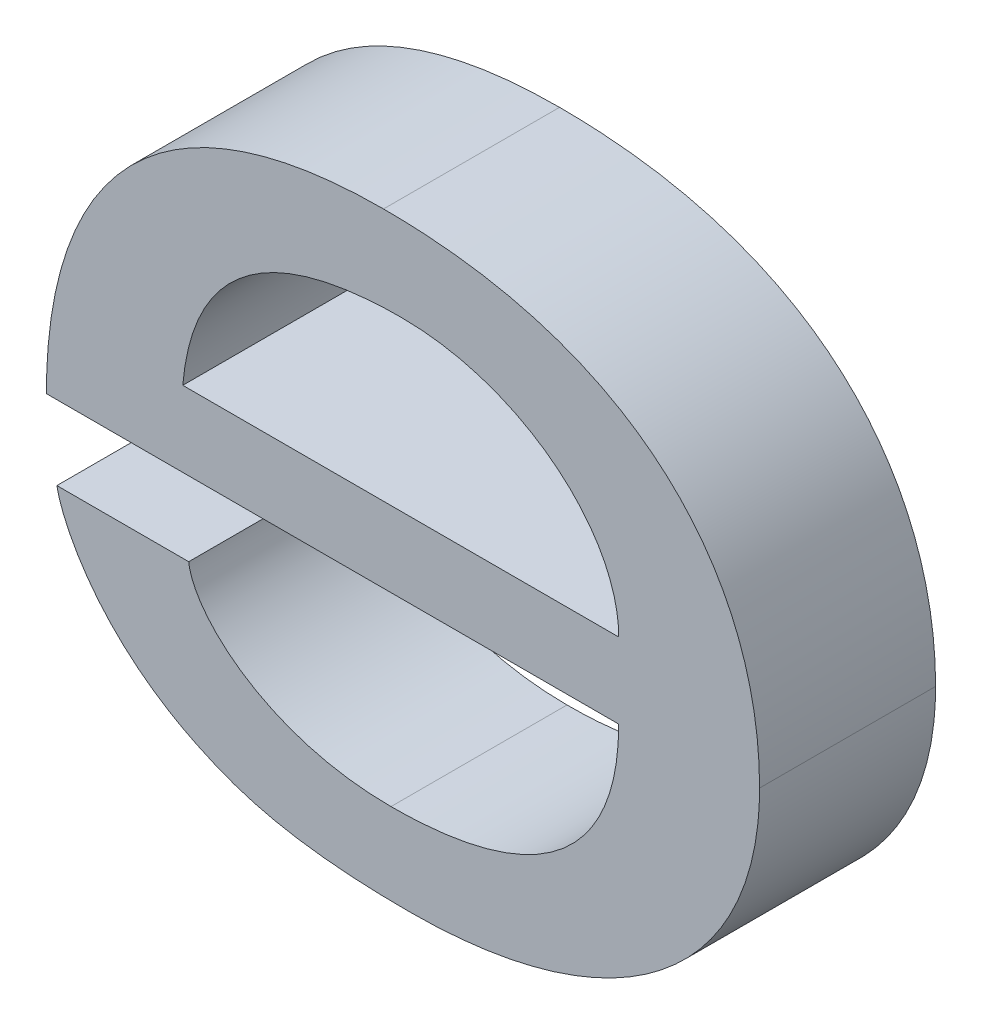
ISO-10303-21;
HEADER;
FILE_DESCRIPTION(('STEP AP214'),'2;1');
FILE_NAME('part.step','',(''),(''),'','','');
FILE_SCHEMA(('AUTOMOTIVE_DESIGN { 1 0 10303 214 1 1 1 1 }'));
ENDSEC;
DATA;
#1=APPLICATION_CONTEXT('core data for automotive mechanical design processes');
#2=APPLICATION_PROTOCOL_DEFINITION('international standard','automotive_design',2000,#1);
#3=PRODUCT_CONTEXT('',#1,'mechanical');
#4=PRODUCT('Part','Part','',(#3));
#5=PRODUCT_RELATED_PRODUCT_CATEGORY('part','',(#4));
#6=PRODUCT_DEFINITION_FORMATION('','',#4);
#7=PRODUCT_DEFINITION_CONTEXT('part definition',#1,'design');
#8=PRODUCT_DEFINITION('design','',#6,#7);
#9=PRODUCT_DEFINITION_SHAPE('','',#8);
#10=(LENGTH_UNIT() NAMED_UNIT(*) SI_UNIT(.MILLI.,.METRE.));
#11=(NAMED_UNIT(*) PLANE_ANGLE_UNIT() SI_UNIT($,.RADIAN.));
#12=(NAMED_UNIT(*) SI_UNIT($,.STERADIAN.) SOLID_ANGLE_UNIT());
#13=UNCERTAINTY_MEASURE_WITH_UNIT(LENGTH_MEASURE(1.E-05),#10,'distance_accuracy_value','');
#14=(GEOMETRIC_REPRESENTATION_CONTEXT(3) GLOBAL_UNCERTAINTY_ASSIGNED_CONTEXT((#13)) GLOBAL_UNIT_ASSIGNED_CONTEXT((#10,
#11,#12)) REPRESENTATION_CONTEXT('',''));
#15=CARTESIAN_POINT('',(0.,0.,0.));
#16=DIRECTION('',(0.,0.,1.));
#17=DIRECTION('',(1.,0.,0.));
#18=AXIS2_PLACEMENT_3D('',#15,#16,#17);
#19=CARTESIAN_POINT('',(-20.972700424746,-0.892675928079,-5.499));
#20=CARTESIAN_POINT('',(-20.972700424746,-0.892675928079,-6.501));
#21=CARTESIAN_POINT('',(-20.930420713635,-0.397040083634,-5.499));
#22=CARTESIAN_POINT('',(-20.930420713635,-0.397040083634,-6.501));
#23=CARTESIAN_POINT('',(-20.641035691412,0.062059271921,-5.499));
#24=CARTESIAN_POINT('',(-20.641035691412,0.062059271921,-6.501));
#25=CARTESIAN_POINT('',(-19.729977202523,0.062059271921,-5.499));
#26=CARTESIAN_POINT('',(-19.729977202523,0.062059271921,-6.501));
#27=(BOUNDED_SURFACE() B_SPLINE_SURFACE(3,1,((#19,#20),(#21,#22),(#23,#24),(#25,#26)),
.UNSPECIFIED.,.F.,.F.,.F.) B_SPLINE_SURFACE_WITH_KNOTS((4,4),(2,2),(0.,1.),(-1.001,0.001),
.UNSPECIFIED.) GEOMETRIC_REPRESENTATION_ITEM() RATIONAL_B_SPLINE_SURFACE(((1.,1.),(1.,1.),(1.,
1.),(1.,1.))) REPRESENTATION_ITEM('') SURFACE());
#28=DIRECTION('',(0.,0.,1.));
#29=VECTOR('',#28,1.);
#30=CARTESIAN_POINT('',(-20.972700424746,-0.892675928079,-6.5));
#31=LINE('',#30,#29);
#32=CARTESIAN_POINT('',(-20.972700424746,-0.892675928079,-6.5));
#33=VERTEX_POINT('',#32);
#34=CARTESIAN_POINT('',(-20.972700424746,-0.892675928079,-5.5));
#35=VERTEX_POINT('',#34);
#36=EDGE_CURVE('E31',#33,#35,#31,.T.);
#37=CARTESIAN_POINT('',(-20.972700424746,-0.892675928079,-6.5));
#38=CARTESIAN_POINT('',(-20.930420713635,-0.397040083634,-6.5));
#39=CARTESIAN_POINT('',(-20.641035691412,0.062059271921,-6.5));
#40=CARTESIAN_POINT('',(-19.729977202523,0.062059271921,-6.5));
#41=(BOUNDED_CURVE() B_SPLINE_CURVE(3,(#37,#38,#39,#40),.UNSPECIFIED.,.F.,
.F.) B_SPLINE_CURVE_WITH_KNOTS((4,4),(0.,1.),
.UNSPECIFIED.) CURVE() GEOMETRIC_REPRESENTATION_ITEM() RATIONAL_B_SPLINE_CURVE((1.,1.,1.,1.)) REPRESENTATION_ITEM(''));
#42=CARTESIAN_POINT('',(-19.729977202523,0.062059271921,-6.5));
#43=VERTEX_POINT('',#42);
#44=EDGE_CURVE('E208',#33,#43,#41,.T.);
#45=DIRECTION('',(0.,0.,1.));
#46=VECTOR('',#45,1.);
#47=CARTESIAN_POINT('',(-19.729977202523,0.062059271921,-6.5));
#48=LINE('',#47,#46);
#49=CARTESIAN_POINT('',(-19.729977202523,0.062059271921,-5.5));
#50=VERTEX_POINT('',#49);
#51=EDGE_CURVE('E11',#43,#50,#48,.T.);
#52=CARTESIAN_POINT('',(-20.972700424746,-0.892675928079,-5.5));
#53=CARTESIAN_POINT('',(-20.930420713635,-0.397040083634,-5.5));
#54=CARTESIAN_POINT('',(-20.641035691412,0.062059271921,-5.5));
#55=CARTESIAN_POINT('',(-19.729977202523,0.062059271921,-5.5));
#56=(BOUNDED_CURVE() B_SPLINE_CURVE(3,(#52,#53,#54,#55),.UNSPECIFIED.,.F.,
.F.) B_SPLINE_CURVE_WITH_KNOTS((4,4),(0.,1.),
.UNSPECIFIED.) CURVE() GEOMETRIC_REPRESENTATION_ITEM() RATIONAL_B_SPLINE_CURVE((1.,1.,1.,1.)) REPRESENTATION_ITEM(''));
#57=EDGE_CURVE('E274',#35,#50,#56,.T.);
#58=ORIENTED_EDGE('',*,*,#36,.F.);
#59=ORIENTED_EDGE('',*,*,#44,.T.);
#60=ORIENTED_EDGE('',*,*,#51,.T.);
#61=ORIENTED_EDGE('',*,*,#57,.F.);
#62=EDGE_LOOP('',(#58,#59,#60,#61));
#63=FACE_BOUND('',#62,.T.);
#64=ADVANCED_FACE('F16',(#63),#27,.F.);
#65=CARTESIAN_POINT('',(-19.729977202523,0.062059271921,-5.499));
#66=CARTESIAN_POINT('',(-19.729977202523,0.062059271921,-6.501));
#67=CARTESIAN_POINT('',(-19.040683291412,0.062059271921,-5.499));
#68=CARTESIAN_POINT('',(-19.040683291412,0.062059271921,-6.501));
#69=CARTESIAN_POINT('',(-18.495737580301,-0.397040083634,-5.499));
#70=CARTESIAN_POINT('',(-18.495737580301,-0.397040083634,-6.501));
#71=CARTESIAN_POINT('',(-18.495737580301,-0.892675928079,-5.499));
#72=CARTESIAN_POINT('',(-18.495737580301,-0.892675928079,-6.501));
#73=(BOUNDED_SURFACE() B_SPLINE_SURFACE(3,1,((#65,#66),(#67,#68),(#69,#70),(#71,#72)),
.UNSPECIFIED.,.F.,.F.,.F.) B_SPLINE_SURFACE_WITH_KNOTS((4,4),(2,2),(0.,1.),(-1.001,0.001),
.UNSPECIFIED.) GEOMETRIC_REPRESENTATION_ITEM() RATIONAL_B_SPLINE_SURFACE(((1.,1.),(1.,1.),(1.,
1.),(1.,1.))) REPRESENTATION_ITEM('') SURFACE());
#74=CARTESIAN_POINT('',(-19.729977202523,0.062059271921,-6.5));
#75=CARTESIAN_POINT('',(-19.040683291412,0.062059271921,-6.5));
#76=CARTESIAN_POINT('',(-18.495737580301,-0.397040083634,-6.5));
#77=CARTESIAN_POINT('',(-18.495737580301,-0.892675928079,-6.5));
#78=(BOUNDED_CURVE() B_SPLINE_CURVE(3,(#74,#75,#76,#77),.UNSPECIFIED.,.F.,
.F.) B_SPLINE_CURVE_WITH_KNOTS((4,4),(0.,1.),
.UNSPECIFIED.) CURVE() GEOMETRIC_REPRESENTATION_ITEM() RATIONAL_B_SPLINE_CURVE((1.,1.,1.,1.)) REPRESENTATION_ITEM(''));
#79=CARTESIAN_POINT('',(-18.495737580301,-0.892675928079,-6.5));
#80=VERTEX_POINT('',#79);
#81=EDGE_CURVE('E213',#43,#80,#78,.T.);
#82=DIRECTION('',(0.,0.,1.));
#83=VECTOR('',#82,1.);
#84=CARTESIAN_POINT('',(-18.495737580301,-0.892675928079,-6.5));
#85=LINE('',#84,#83);
#86=CARTESIAN_POINT('',(-18.495737580301,-0.892675928079,-5.5));
#87=VERTEX_POINT('',#86);
#88=EDGE_CURVE('E190',#80,#87,#85,.T.);
#89=CARTESIAN_POINT('',(-19.729977202523,0.062059271921,-5.5));
#90=CARTESIAN_POINT('',(-19.040683291412,0.062059271921,-5.5));
#91=CARTESIAN_POINT('',(-18.495737580301,-0.397040083634,-5.5));
#92=CARTESIAN_POINT('',(-18.495737580301,-0.892675928079,-5.5));
#93=(BOUNDED_CURVE() B_SPLINE_CURVE(3,(#89,#90,#91,#92),.UNSPECIFIED.,.F.,
.F.) B_SPLINE_CURVE_WITH_KNOTS((4,4),(0.,1.),
.UNSPECIFIED.) CURVE() GEOMETRIC_REPRESENTATION_ITEM() RATIONAL_B_SPLINE_CURVE((1.,1.,1.,1.)) REPRESENTATION_ITEM(''));
#94=EDGE_CURVE('E268',#50,#87,#93,.T.);
#95=ORIENTED_EDGE('',*,*,#51,.F.);
#96=ORIENTED_EDGE('',*,*,#81,.T.);
#97=ORIENTED_EDGE('',*,*,#88,.T.);
#98=ORIENTED_EDGE('',*,*,#94,.F.);
#99=EDGE_LOOP('',(#95,#96,#97,#98));
#100=FACE_BOUND('',#99,.T.);
#101=ADVANCED_FACE('F364',(#100),#73,.F.);
#102=CARTESIAN_POINT('',(-19.7342190025235,-0.892675928079,-5.49));
#103=DIRECTION('',(0.,-1.,0.));
#104=DIRECTION('',(0.,0.,1.));
#105=AXIS2_PLACEMENT_3D('',#102,#103,#104);
#106=PLANE('',#105);
#107=ORIENTED_EDGE('',*,*,#88,.F.);
#108=DIRECTION('',(-1.,0.,0.));
#109=VECTOR('',#108,1.);
#110=CARTESIAN_POINT('',(-18.495737580301,-0.892675928079,-6.5));
#111=LINE('',#110,#109);
#112=EDGE_CURVE('E222',#80,#33,#111,.T.);
#113=ORIENTED_EDGE('',*,*,#112,.T.);
#114=ORIENTED_EDGE('',*,*,#36,.T.);
#115=DIRECTION('',(-1.,0.,0.));
#116=VECTOR('',#115,1.);
#117=CARTESIAN_POINT('',(-18.495737580301,-0.892675928079,-5.5));
#118=LINE('',#117,#116);
#119=EDGE_CURVE('E283',#87,#35,#118,.T.);
#120=ORIENTED_EDGE('',*,*,#119,.F.);
#121=EDGE_LOOP('',(#107,#113,#114,#120));
#122=FACE_BOUND('',#121,.T.);
#123=ADVANCED_FACE('F358',(#122),#106,.F.);
#124=CARTESIAN_POINT('',(-20.121618391412,-1.321224728079,-5.49));
#125=DIRECTION('',(0.,1.,0.));
#126=DIRECTION('',(-1.,0.,0.));
#127=AXIS2_PLACEMENT_3D('',#124,#125,#126);
#128=PLANE('',#127);
#129=DIRECTION('',(0.,0.,1.));
#130=VECTOR('',#129,1.);
#131=CARTESIAN_POINT('',(-21.747499202523,-1.321224728079,-6.5));
#132=LINE('',#131,#130);
#133=CARTESIAN_POINT('',(-21.747499202523,-1.321224728079,-6.5));
#134=VERTEX_POINT('',#133);
#135=CARTESIAN_POINT('',(-21.747499202523,-1.321224728079,-5.5));
#136=VERTEX_POINT('',#135);
#137=EDGE_CURVE('E123',#134,#136,#132,.T.);
#138=ORIENTED_EDGE('',*,*,#137,.F.);
#139=DIRECTION('',(1.,0.,0.));
#140=VECTOR('',#139,1.);
#141=CARTESIAN_POINT('',(-21.747499202523,-1.321224728079,-6.5));
#142=LINE('',#141,#140);
#143=CARTESIAN_POINT('',(-18.495737580301,-1.321224728079,-6.5));
#144=VERTEX_POINT('',#143);
#145=EDGE_CURVE('E248',#134,#144,#142,.T.);
#146=ORIENTED_EDGE('',*,*,#145,.T.);
#147=DIRECTION('',(0.,0.,1.));
#148=VECTOR('',#147,1.);
#149=CARTESIAN_POINT('',(-18.495737580301,-1.321224728079,-6.5));
#150=LINE('',#149,#148);
#151=CARTESIAN_POINT('',(-18.495737580301,-1.321224728079,-5.5));
#152=VERTEX_POINT('',#151);
#153=EDGE_CURVE('E131',#144,#152,#150,.T.);
#154=ORIENTED_EDGE('',*,*,#153,.T.);
#155=DIRECTION('',(1.,0.,0.));
#156=VECTOR('',#155,1.);
#157=CARTESIAN_POINT('',(-21.747499202523,-1.321224728079,-5.5));
#158=LINE('',#157,#156);
#159=EDGE_CURVE('E179',#136,#152,#158,.T.);
#160=ORIENTED_EDGE('',*,*,#159,.F.);
#161=EDGE_LOOP('',(#138,#146,#154,#160));
#162=FACE_BOUND('',#161,.T.);
#163=ADVANCED_FACE('F346',(#162),#128,.F.);
#164=CARTESIAN_POINT('',(-19.832051335857,0.54540716081,-5.499));
#165=CARTESIAN_POINT('',(-19.832051335857,0.54540716081,-6.501));
#166=CARTESIAN_POINT('',(-21.117455024746,0.54540716081,-5.499));
#167=CARTESIAN_POINT('',(-21.117455024746,0.54540716081,-6.501));
#168=CARTESIAN_POINT('',(-21.747499202523,-0.189047950301,-5.499));
#169=CARTESIAN_POINT('',(-21.747499202523,-0.189047950301,-6.501));
#170=CARTESIAN_POINT('',(-21.747499202523,-1.321224728079,-5.499));
#171=CARTESIAN_POINT('',(-21.747499202523,-1.321224728079,-6.501));
#172=(BOUNDED_SURFACE() B_SPLINE_SURFACE(3,1,((#164,#165),(#166,#167),(#168,#169),(#170,#171)),
.UNSPECIFIED.,.F.,.F.,.F.) B_SPLINE_SURFACE_WITH_KNOTS((4,4),(2,2),(0.,1.),(-1.001,0.001),
.UNSPECIFIED.) GEOMETRIC_REPRESENTATION_ITEM() RATIONAL_B_SPLINE_SURFACE(((1.,1.),(1.,1.),(1.,
1.),(1.,1.))) REPRESENTATION_ITEM('') SURFACE());
#173=DIRECTION('',(0.,0.,1.));
#174=VECTOR('',#173,1.);
#175=CARTESIAN_POINT('',(-19.832051335857,0.54540716081,-6.5));
#176=LINE('',#175,#174);
#177=CARTESIAN_POINT('',(-19.832051335857,0.54540716081,-6.5));
#178=VERTEX_POINT('',#177);
#179=CARTESIAN_POINT('',(-19.832051335857,0.54540716081,-5.5));
#180=VERTEX_POINT('',#179);
#181=EDGE_CURVE('E112',#178,#180,#176,.T.);
#182=CARTESIAN_POINT('',(-19.832051335857,0.54540716081,-6.5));
#183=CARTESIAN_POINT('',(-21.117455024746,0.54540716081,-6.5));
#184=CARTESIAN_POINT('',(-21.747499202523,-0.189047950301,-6.5));
#185=CARTESIAN_POINT('',(-21.747499202523,-1.321224728079,-6.5));
#186=(BOUNDED_CURVE() B_SPLINE_CURVE(3,(#182,#183,#184,#185),.UNSPECIFIED.,.F.,
.F.) B_SPLINE_CURVE_WITH_KNOTS((4,4),(0.,1.),
.UNSPECIFIED.) CURVE() GEOMETRIC_REPRESENTATION_ITEM() RATIONAL_B_SPLINE_CURVE((1.,1.,1.,1.)) REPRESENTATION_ITEM(''));
#187=EDGE_CURVE('E242',#178,#134,#186,.T.);
#188=CARTESIAN_POINT('',(-19.832051335857,0.54540716081,-5.5));
#189=CARTESIAN_POINT('',(-21.117455024746,0.54540716081,-5.5));
#190=CARTESIAN_POINT('',(-21.747499202523,-0.189047950301,-5.5));
#191=CARTESIAN_POINT('',(-21.747499202523,-1.321224728079,-5.5));
#192=(BOUNDED_CURVE() B_SPLINE_CURVE(3,(#188,#189,#190,#191),.UNSPECIFIED.,.F.,
.F.) B_SPLINE_CURVE_WITH_KNOTS((4,4),(0.,1.),
.UNSPECIFIED.) CURVE() GEOMETRIC_REPRESENTATION_ITEM() RATIONAL_B_SPLINE_CURVE((1.,1.,1.,1.)) REPRESENTATION_ITEM(''));
#193=EDGE_CURVE('E186',#180,#136,#192,.T.);
#194=ORIENTED_EDGE('',*,*,#181,.F.);
#195=ORIENTED_EDGE('',*,*,#187,.T.);
#196=ORIENTED_EDGE('',*,*,#137,.T.);
#197=ORIENTED_EDGE('',*,*,#193,.F.);
#198=EDGE_LOOP('',(#194,#195,#196,#197));
#199=FACE_BOUND('',#198,.T.);
#200=ADVANCED_FACE('F349',(#199),#172,.F.);
#201=CARTESIAN_POINT('',(-18.4957374723085,-1.3202244733093,-6.5));
#202=CARTESIAN_POINT('',(-18.4956529423513,-1.71205025058814,-6.50000000000001));
#203=CARTESIAN_POINT('',(-18.6912474776482,-1.9644500117654,-6.5));
#204=CARTESIAN_POINT('',(-19.0089810585719,-2.37446085292429,-6.50000000000001));
#205=CARTESIAN_POINT('',(-19.7906335328577,-2.37387352911461,-6.5));
#206=CARTESIAN_POINT('',(-18.4957374723085,-1.3202244733093,-5.5));
#207=CARTESIAN_POINT('',(-18.4956529423513,-1.71205025058814,-5.50000000000001));
#208=CARTESIAN_POINT('',(-18.6912474776482,-1.9644500117654,-5.5));
#209=CARTESIAN_POINT('',(-19.0089810585719,-2.37446085292429,-5.5));
#210=CARTESIAN_POINT('',(-19.7906335328577,-2.37387352911461,-5.50000000000001));
#211=(BOUNDED_SURFACE() B_SPLINE_SURFACE(1,2,((#201,#202,#203,#204,#205),(#206,#207,#208,#209,
#210)),.UNSPECIFIED.,.F.,.F.,.F.) B_SPLINE_SURFACE_WITH_KNOTS((2,2),(3,2,3),(-0.126057435247208,
-0.000125931503743459),(47.814926959493,49.8936733097309,53.1706103039778),
.UNSPECIFIED.) GEOMETRIC_REPRESENTATION_ITEM() RATIONAL_B_SPLINE_SURFACE(((0.918645678825365,
0.95118814316691,1.,0.923052959589836,0.886535991626344),(0.918645678825365,0.95118814316691,1.,
0.923052959589836,0.886535991626344))) REPRESENTATION_ITEM('') SURFACE());
#212=CARTESIAN_POINT('',(-24.9679788507546,2.8996368256372,-6.5));
#213=DIRECTION('',(0.,0.,-1.));
#214=DIRECTION('',(-0.79043822040908,0.612541769772908,0.));
#215=AXIS2_PLACEMENT_3D('',#212,#213,#214);
#216=ELLIPSE('',#215,7.94082473625571,2.57742728566386);
#217=CARTESIAN_POINT('',(-19.789633335857,-2.373874105857,-6.5));
#218=VERTEX_POINT('',#217);
#219=EDGE_CURVE('E165',#144,#218,#216,.T.);
#220=DIRECTION('',(0.,0.,1.));
#221=VECTOR('',#220,1.);
#222=CARTESIAN_POINT('',(-19.789633335857,-2.373874105857,-6.5));
#223=LINE('',#222,#221);
#224=CARTESIAN_POINT('',(-19.789633335857,-2.373874105857,-5.5));
#225=VERTEX_POINT('',#224);
#226=EDGE_CURVE('E142',#218,#225,#223,.T.);
#227=CARTESIAN_POINT('',(-24.9679788507556,2.89963682563805,-5.5));
#228=DIRECTION('',(0.,0.,-1.));
#229=DIRECTION('',(-0.790438220409078,0.612541769772911,0.));
#230=AXIS2_PLACEMENT_3D('',#227,#228,#229);
#231=ELLIPSE('',#230,7.94082473625714,2.5774272856641);
#232=EDGE_CURVE('E162',#152,#225,#231,.T.);
#233=ORIENTED_EDGE('',*,*,#153,.F.);
#234=ORIENTED_EDGE('',*,*,#219,.T.);
#235=ORIENTED_EDGE('',*,*,#226,.T.);
#236=ORIENTED_EDGE('',*,*,#232,.F.);
#237=EDGE_LOOP('',(#233,#234,#235,#236));
#238=FACE_BOUND('',#237,.T.);
#239=ADVANCED_FACE('F160',(#238),#211,.F.);
#240=CARTESIAN_POINT('',(-17.695488002523,-1.23556463919,-5.499));
#241=CARTESIAN_POINT('',(-17.695488002523,-1.23556463919,-6.501));
#242=CARTESIAN_POINT('',(-17.695488002523,-0.244081283634001,-5.499));
#243=CARTESIAN_POINT('',(-17.695488002523,-0.244081283634001,-6.501));
#244=CARTESIAN_POINT('',(-18.359331113635,0.54540716081,-5.499));
#245=CARTESIAN_POINT('',(-18.359331113635,0.54540716081,-6.501));
#246=CARTESIAN_POINT('',(-19.832051335857,0.54540716081,-5.499));
#247=CARTESIAN_POINT('',(-19.832051335857,0.54540716081,-6.501));
#248=(BOUNDED_SURFACE() B_SPLINE_SURFACE(3,1,((#240,#241),(#242,#243),(#244,#245),(#246,#247)),
.UNSPECIFIED.,.F.,.F.,.F.) B_SPLINE_SURFACE_WITH_KNOTS((4,4),(2,2),(0.,1.),(-1.001,0.001),
.UNSPECIFIED.) GEOMETRIC_REPRESENTATION_ITEM() RATIONAL_B_SPLINE_SURFACE(((1.,1.),(1.,1.),(1.,
1.),(1.,1.))) REPRESENTATION_ITEM('') SURFACE());
#249=DIRECTION('',(0.,0.,1.));
#250=VECTOR('',#249,1.);
#251=CARTESIAN_POINT('',(-17.695488002523,-1.23556463919,-6.5));
#252=LINE('',#251,#250);
#253=CARTESIAN_POINT('',(-17.695488002523,-1.23556463919,-6.5));
#254=VERTEX_POINT('',#253);
#255=CARTESIAN_POINT('',(-17.695488002523,-1.23556463919,-5.5));
#256=VERTEX_POINT('',#255);
#257=EDGE_CURVE('E168',#254,#256,#252,.T.);
#258=CARTESIAN_POINT('',(-17.695488002523,-1.23556463919,-6.5));
#259=CARTESIAN_POINT('',(-17.695488002523,-0.244081283634001,-6.5));
#260=CARTESIAN_POINT('',(-18.359331113635,0.54540716081,-6.5));
#261=CARTESIAN_POINT('',(-19.832051335857,0.54540716081,-6.5));
#262=(BOUNDED_CURVE() B_SPLINE_CURVE(3,(#258,#259,#260,#261),.UNSPECIFIED.,.F.,
.F.) B_SPLINE_CURVE_WITH_KNOTS((4,4),(0.,1.),
.UNSPECIFIED.) CURVE() GEOMETRIC_REPRESENTATION_ITEM() RATIONAL_B_SPLINE_CURVE((1.,1.,1.,1.)) REPRESENTATION_ITEM(''));
#263=EDGE_CURVE('E247',#254,#178,#262,.T.);
#264=CARTESIAN_POINT('',(-17.695488002523,-1.23556463919,-5.5));
#265=CARTESIAN_POINT('',(-17.695488002523,-0.244081283634001,-5.5));
#266=CARTESIAN_POINT('',(-18.359331113635,0.54540716081,-5.5));
#267=CARTESIAN_POINT('',(-19.832051335857,0.54540716081,-5.5));
#268=(BOUNDED_CURVE() B_SPLINE_CURVE(3,(#264,#265,#266,#267),.UNSPECIFIED.,.F.,
.F.) B_SPLINE_CURVE_WITH_KNOTS((4,4),(0.,1.),
.UNSPECIFIED.) CURVE() GEOMETRIC_REPRESENTATION_ITEM() RATIONAL_B_SPLINE_CURVE((1.,1.,1.,1.)) REPRESENTATION_ITEM(''));
#269=EDGE_CURVE('E230',#256,#180,#268,.T.);
#270=ORIENTED_EDGE('',*,*,#257,.F.);
#271=ORIENTED_EDGE('',*,*,#263,.T.);
#272=ORIENTED_EDGE('',*,*,#181,.T.);
#273=ORIENTED_EDGE('',*,*,#269,.F.);
#274=EDGE_LOOP('',(#270,#271,#272,#273));
#275=FACE_BOUND('',#274,.T.);
#276=ADVANCED_FACE('F18',(#275),#248,.F.);
#277=CARTESIAN_POINT('',(-19.789633335857,-2.373874105857,-5.49861088596473));
#278=CARTESIAN_POINT('',(-19.789633335857,-2.373874105857,-6.50138911403527));
#279=CARTESIAN_POINT('',(-20.496154091412,-2.373874105857,-5.49861088596473));
#280=CARTESIAN_POINT('',(-20.496154091412,-2.373874105857,-6.50138911403527));
#281=CARTESIAN_POINT('',(-20.913453513635,-1.982152483634,-5.49861088596473));
#282=CARTESIAN_POINT('',(-20.913453513635,-1.982152483634,-6.50138911403527));
#283=CARTESIAN_POINT('',(-20.938904313635,-1.743544883634,-5.49861088596473));
#284=CARTESIAN_POINT('',(-20.938904313635,-1.743544883634,-6.50138911403527));
#285=(BOUNDED_SURFACE() B_SPLINE_SURFACE(3,1,((#277,#278),(#279,#280),(#281,#282),(#283,#284)),
.UNSPECIFIED.,.F.,.F.,.F.) B_SPLINE_SURFACE_WITH_KNOTS((4,4),(2,2),(0.,1.),(-1.00138911403527,
0.0013891140352706),
.UNSPECIFIED.) GEOMETRIC_REPRESENTATION_ITEM() RATIONAL_B_SPLINE_SURFACE(((1.,1.),(1.,1.),(1.,
1.),(1.,1.))) REPRESENTATION_ITEM('') SURFACE());
#286=CARTESIAN_POINT('',(-19.789633335857,-2.373874105857,-6.5));
#287=CARTESIAN_POINT('',(-20.496154091412,-2.373874105857,-6.5));
#288=CARTESIAN_POINT('',(-20.913453513635,-1.982152483634,-6.5));
#289=CARTESIAN_POINT('',(-20.938904313635,-1.743544883634,-6.5));
#290=(BOUNDED_CURVE() B_SPLINE_CURVE(3,(#286,#287,#288,#289),.UNSPECIFIED.,.F.,
.F.) B_SPLINE_CURVE_WITH_KNOTS((4,4),(0.,1.),
.UNSPECIFIED.) CURVE() GEOMETRIC_REPRESENTATION_ITEM() RATIONAL_B_SPLINE_CURVE((1.,1.,1.,1.)) REPRESENTATION_ITEM(''));
#291=CARTESIAN_POINT('',(-20.938904313635,-1.743544883634,-6.5));
#292=VERTEX_POINT('',#291);
#293=EDGE_CURVE('E289',#218,#292,#290,.T.);
#294=DIRECTION('',(0.,0.,1.));
#295=VECTOR('',#294,1.);
#296=CARTESIAN_POINT('',(-20.938904313635,-1.743544883634,-6.5));
#297=LINE('',#296,#295);
#298=CARTESIAN_POINT('',(-20.938904313635,-1.743544883634,-5.5));
#299=VERTEX_POINT('',#298);
#300=EDGE_CURVE('E172',#292,#299,#297,.T.);
#301=CARTESIAN_POINT('',(-19.789633335857,-2.373874105857,-5.5));
#302=CARTESIAN_POINT('',(-20.496154091412,-2.373874105857,-5.5));
#303=CARTESIAN_POINT('',(-20.913453513635,-1.982152483634,-5.5));
#304=CARTESIAN_POINT('',(-20.938904313635,-1.743544883634,-5.5));
#305=(BOUNDED_CURVE() B_SPLINE_CURVE(3,(#301,#302,#303,#304),.UNSPECIFIED.,.F.,
.F.) B_SPLINE_CURVE_WITH_KNOTS((4,4),(0.,1.),
.UNSPECIFIED.) CURVE() GEOMETRIC_REPRESENTATION_ITEM() RATIONAL_B_SPLINE_CURVE((1.,1.,1.,1.)) REPRESENTATION_ITEM(''));
#306=EDGE_CURVE('E22',#225,#299,#305,.T.);
#307=ORIENTED_EDGE('',*,*,#226,.F.);
#308=ORIENTED_EDGE('',*,*,#293,.T.);
#309=ORIENTED_EDGE('',*,*,#300,.T.);
#310=ORIENTED_EDGE('',*,*,#306,.F.);
#311=EDGE_LOOP('',(#307,#308,#309,#310));
#312=FACE_BOUND('',#311,.T.);
#313=ADVANCED_FACE('F171',(#312),#285,.F.);
#314=CARTESIAN_POINT('',(-19.687299558079,-2.83924443919,-5.499));
#315=CARTESIAN_POINT('',(-19.687299558079,-2.83924443919,-6.501));
#316=CARTESIAN_POINT('',(-18.436225380301,-2.83924443919,-5.499));
#317=CARTESIAN_POINT('',(-18.436225380301,-2.83924443919,-6.501));
#318=CARTESIAN_POINT('',(-17.695488002523,-2.15981983919,-5.499));
#319=CARTESIAN_POINT('',(-17.695488002523,-2.15981983919,-6.501));
#320=CARTESIAN_POINT('',(-17.695488002523,-1.23556463919,-5.499));
#321=CARTESIAN_POINT('',(-17.695488002523,-1.23556463919,-6.501));
#322=(BOUNDED_SURFACE() B_SPLINE_SURFACE(3,1,((#314,#315),(#316,#317),(#318,#319),(#320,#321)),
.UNSPECIFIED.,.F.,.F.,.F.) B_SPLINE_SURFACE_WITH_KNOTS((4,4),(2,2),(0.,1.),(-1.001,0.001),
.UNSPECIFIED.) GEOMETRIC_REPRESENTATION_ITEM() RATIONAL_B_SPLINE_SURFACE(((1.,1.),(1.,1.),(1.,
1.),(1.,1.))) REPRESENTATION_ITEM('') SURFACE());
#323=DIRECTION('',(0.,0.,1.));
#324=VECTOR('',#323,1.);
#325=CARTESIAN_POINT('',(-19.687299558079,-2.83924443919,-6.5));
#326=LINE('',#325,#324);
#327=CARTESIAN_POINT('',(-19.687299558079,-2.83924443919,-6.5));
#328=VERTEX_POINT('',#327);
#329=CARTESIAN_POINT('',(-19.687299558079,-2.83924443919,-5.5));
#330=VERTEX_POINT('',#329);
#331=EDGE_CURVE('E310',#328,#330,#326,.T.);
#332=CARTESIAN_POINT('',(-19.687299558079,-2.83924443919,-6.5));
#333=CARTESIAN_POINT('',(-18.436225380301,-2.83924443919,-6.5));
#334=CARTESIAN_POINT('',(-17.695488002523,-2.15981983919,-6.5));
#335=CARTESIAN_POINT('',(-17.695488002523,-1.23556463919,-6.5));
#336=(BOUNDED_CURVE() B_SPLINE_CURVE(3,(#332,#333,#334,#335),.UNSPECIFIED.,.F.,
.F.) B_SPLINE_CURVE_WITH_KNOTS((4,4),(0.,1.),
.UNSPECIFIED.) CURVE() GEOMETRIC_REPRESENTATION_ITEM() RATIONAL_B_SPLINE_CURVE((1.,1.,1.,1.)) REPRESENTATION_ITEM(''));
#337=EDGE_CURVE('E255',#328,#254,#336,.T.);
#338=CARTESIAN_POINT('',(-19.687299558079,-2.83924443919,-5.5));
#339=CARTESIAN_POINT('',(-18.436225380301,-2.83924443919,-5.5));
#340=CARTESIAN_POINT('',(-17.695488002523,-2.15981983919,-5.5));
#341=CARTESIAN_POINT('',(-17.695488002523,-1.23556463919,-5.5));
#342=(BOUNDED_CURVE() B_SPLINE_CURVE(3,(#338,#339,#340,#341),.UNSPECIFIED.,.F.,
.F.) B_SPLINE_CURVE_WITH_KNOTS((4,4),(0.,1.),
.UNSPECIFIED.) CURVE() GEOMETRIC_REPRESENTATION_ITEM() RATIONAL_B_SPLINE_CURVE((1.,1.,1.,1.)) REPRESENTATION_ITEM(''));
#343=EDGE_CURVE('E212',#330,#256,#342,.T.);
#344=ORIENTED_EDGE('',*,*,#331,.F.);
#345=ORIENTED_EDGE('',*,*,#337,.T.);
#346=ORIENTED_EDGE('',*,*,#257,.T.);
#347=ORIENTED_EDGE('',*,*,#343,.F.);
#348=EDGE_LOOP('',(#344,#345,#346,#347));
#349=FACE_BOUND('',#348,.T.);
#350=ADVANCED_FACE('F424',(#349),#322,.F.);
#351=CARTESIAN_POINT('',(-21.313440013635,-1.743544883634,-5.49));
#352=DIRECTION('',(0.,-1.,0.));
#353=DIRECTION('',(0.,0.,1.));
#354=AXIS2_PLACEMENT_3D('',#351,#352,#353);
#355=PLANE('',#354);
#356=ORIENTED_EDGE('',*,*,#300,.F.);
#357=DIRECTION('',(-1.,0.,0.));
#358=VECTOR('',#357,1.);
#359=CARTESIAN_POINT('',(-20.938904313635,-1.743544883634,-6.5));
#360=LINE('',#359,#358);
#361=CARTESIAN_POINT('',(-21.6879754215455,-1.74354455506727,-6.5));
#362=VERTEX_POINT('',#361);
#363=EDGE_CURVE('E296',#292,#362,#360,.T.);
#364=ORIENTED_EDGE('',*,*,#363,.T.);
#365=DIRECTION('',(0.,0.,1.));
#366=VECTOR('',#365,1.);
#367=CARTESIAN_POINT('',(-21.6879752445072,-1.743544883634,-6.5));
#368=LINE('',#367,#366);
#369=CARTESIAN_POINT('',(-21.6879754215456,-1.74354455506722,-5.5));
#370=VERTEX_POINT('',#369);
#371=EDGE_CURVE('E256',#362,#370,#368,.T.);
#372=ORIENTED_EDGE('',*,*,#371,.T.);
#373=DIRECTION('',(-1.,0.,0.));
#374=VECTOR('',#373,1.);
#375=CARTESIAN_POINT('',(-20.938904313635,-1.743544883634,-5.5));
#376=LINE('',#375,#374);
#377=EDGE_CURVE('E176',#299,#370,#376,.T.);
#378=ORIENTED_EDGE('',*,*,#377,.F.);
#379=EDGE_LOOP('',(#356,#364,#372,#378));
#380=FACE_BOUND('',#379,.T.);
#381=ADVANCED_FACE('F375',(#380),#355,.F.);
#382=CARTESIAN_POINT('',(-19.754344827656,-1.343617580906,-5.5));
#383=DIRECTION('',(0.,0.,1.));
#384=DIRECTION('',(0.,-1.,0.));
#385=AXIS2_PLACEMENT_3D('',#382,#383,#384);
#386=PLANE('',#385);
#387=ORIENTED_EDGE('',*,*,#119,.T.);
#388=ORIENTED_EDGE('',*,*,#57,.T.);
#389=ORIENTED_EDGE('',*,*,#94,.T.);
#390=EDGE_LOOP('',(#387,#388,#389));
#391=FACE_BOUND('',#390,.T.);
#392=CARTESIAN_POINT('',(-21.6879753024166,-1.74354453526628,-5.5));
#393=CARTESIAN_POINT('',(-21.6625232791097,-1.89665970431232,-5.5));
#394=CARTESIAN_POINT('',(-21.4581119342893,-2.34945449402138,-5.5));
#395=CARTESIAN_POINT('',(-20.896348024746,-2.618842994746,-5.5));
#396=(BOUNDED_CURVE() B_SPLINE_CURVE(3,(#392,#393,#394,#395),.UNSPECIFIED.,.F.,
.F.) B_SPLINE_CURVE_WITH_KNOTS((4,4),(3.99813600454743E-06,1.),
.UNSPECIFIED.) CURVE() GEOMETRIC_REPRESENTATION_ITEM() RATIONAL_B_SPLINE_CURVE((1.,1.,1.,1.)) REPRESENTATION_ITEM(''));
#397=CARTESIAN_POINT('',(-20.896348024746,-2.618842994746,-5.5));
#398=VERTEX_POINT('',#397);
#399=EDGE_CURVE('E311',#370,#398,#396,.T.);
#400=ORIENTED_EDGE('',*,*,#399,.T.);
#401=CARTESIAN_POINT('',(-20.896348024746,-2.618842994746,-5.5));
#402=CARTESIAN_POINT('',(-20.691942935857,-2.716621705857,-5.5));
#403=CARTESIAN_POINT('',(-20.402436558079,-2.83924443919,-5.5));
#404=CARTESIAN_POINT('',(-19.687299558079,-2.83924443919,-5.5));
#405=(BOUNDED_CURVE() B_SPLINE_CURVE(3,(#401,#402,#403,#404),.UNSPECIFIED.,.F.,
.F.) B_SPLINE_CURVE_WITH_KNOTS((4,4),(0.,1.),
.UNSPECIFIED.) CURVE() GEOMETRIC_REPRESENTATION_ITEM() RATIONAL_B_SPLINE_CURVE((1.,1.,1.,1.)) REPRESENTATION_ITEM(''));
#406=EDGE_CURVE('E81',#398,#330,#405,.T.);
#407=ORIENTED_EDGE('',*,*,#406,.T.);
#408=ORIENTED_EDGE('',*,*,#343,.T.);
#409=ORIENTED_EDGE('',*,*,#269,.T.);
#410=ORIENTED_EDGE('',*,*,#193,.T.);
#411=ORIENTED_EDGE('',*,*,#159,.T.);
#412=ORIENTED_EDGE('',*,*,#232,.T.);
#413=ORIENTED_EDGE('',*,*,#306,.T.);
#414=ORIENTED_EDGE('',*,*,#377,.T.);
#415=EDGE_LOOP('',(#400,#407,#408,#409,#410,#411,#412,#413,#414));
#416=FACE_BOUND('',#415,.T.);
#417=ADVANCED_FACE('F177',(#391,#416),#386,.T.);
#418=CARTESIAN_POINT('',(-19.754344827656,-1.343617580906,-6.5));
#419=DIRECTION('',(0.,0.,1.));
#420=DIRECTION('',(0.,-1.,0.));
#421=AXIS2_PLACEMENT_3D('',#418,#419,#420);
#422=PLANE('',#421);
#423=ORIENTED_EDGE('',*,*,#112,.F.);
#424=ORIENTED_EDGE('',*,*,#81,.F.);
#425=ORIENTED_EDGE('',*,*,#44,.F.);
#426=EDGE_LOOP('',(#423,#424,#425));
#427=FACE_BOUND('',#426,.T.);
#428=ORIENTED_EDGE('',*,*,#363,.F.);
#429=ORIENTED_EDGE('',*,*,#293,.F.);
#430=ORIENTED_EDGE('',*,*,#219,.F.);
#431=ORIENTED_EDGE('',*,*,#145,.F.);
#432=ORIENTED_EDGE('',*,*,#187,.F.);
#433=ORIENTED_EDGE('',*,*,#263,.F.);
#434=ORIENTED_EDGE('',*,*,#337,.F.);
#435=CARTESIAN_POINT('',(-20.896348024746,-2.618842994746,-6.5));
#436=CARTESIAN_POINT('',(-20.691942935857,-2.716621705857,-6.5));
#437=CARTESIAN_POINT('',(-20.402436558079,-2.83924443919,-6.5));
#438=CARTESIAN_POINT('',(-19.687299558079,-2.83924443919,-6.5));
#439=(BOUNDED_CURVE() B_SPLINE_CURVE(3,(#435,#436,#437,#438),.UNSPECIFIED.,.F.,
.F.) B_SPLINE_CURVE_WITH_KNOTS((4,4),(0.,1.),
.UNSPECIFIED.) CURVE() GEOMETRIC_REPRESENTATION_ITEM() RATIONAL_B_SPLINE_CURVE((1.,1.,1.,1.)) REPRESENTATION_ITEM(''));
#440=CARTESIAN_POINT('',(-20.896348024746,-2.618842994746,-6.5));
#441=VERTEX_POINT('',#440);
#442=EDGE_CURVE('E95',#441,#328,#439,.T.);
#443=ORIENTED_EDGE('',*,*,#442,.F.);
#444=CARTESIAN_POINT('',(-21.6879753024167,-1.74354453526635,-6.5));
#445=CARTESIAN_POINT('',(-21.6625232791096,-1.89665970431263,-6.5));
#446=CARTESIAN_POINT('',(-21.4581119342891,-2.34945449402147,-6.5));
#447=CARTESIAN_POINT('',(-20.896348024746,-2.618842994746,-6.5));
#448=(BOUNDED_CURVE() B_SPLINE_CURVE(3,(#444,#445,#446,#447),.UNSPECIFIED.,.F.,
.F.) B_SPLINE_CURVE_WITH_KNOTS((4,4),(3.99813626161346E-06,1.),
.UNSPECIFIED.) CURVE() GEOMETRIC_REPRESENTATION_ITEM() RATIONAL_B_SPLINE_CURVE((1.,1.,1.,1.)) REPRESENTATION_ITEM(''));
#449=EDGE_CURVE('E204',#362,#441,#448,.T.);
#450=ORIENTED_EDGE('',*,*,#449,.F.);
#451=EDGE_LOOP('',(#428,#429,#430,#431,#432,#433,#434,#443,#450));
#452=FACE_BOUND('',#451,.T.);
#453=ADVANCED_FACE('F328',(#427,#452),#422,.F.);
#454=CARTESIAN_POINT('',(-20.896348024746,-2.618842994746,-5.49852890113478));
#455=CARTESIAN_POINT('',(-20.896348024746,-2.618842994746,-6.50147109886523));
#456=CARTESIAN_POINT('',(-20.691942935857,-2.716621705857,-5.49852890113478));
#457=CARTESIAN_POINT('',(-20.691942935857,-2.716621705857,-6.50147109886523));
#458=CARTESIAN_POINT('',(-20.402436558079,-2.83924443919,-5.49852890113478));
#459=CARTESIAN_POINT('',(-20.402436558079,-2.83924443919,-6.50147109886523));
#460=CARTESIAN_POINT('',(-19.687299558079,-2.83924443919,-5.49852890113478));
#461=CARTESIAN_POINT('',(-19.687299558079,-2.83924443919,-6.50147109886523));
#462=(BOUNDED_SURFACE() B_SPLINE_SURFACE(3,1,((#454,#455),(#456,#457),(#458,#459),(#460,#461)),
.UNSPECIFIED.,.F.,.F.,.F.) B_SPLINE_SURFACE_WITH_KNOTS((4,4),(2,2),(0.,1.),(-1.00147109886523,
0.00147109886522625),
.UNSPECIFIED.) GEOMETRIC_REPRESENTATION_ITEM() RATIONAL_B_SPLINE_SURFACE(((1.,1.),(1.,1.),(1.,
1.),(1.,1.))) REPRESENTATION_ITEM('') SURFACE());
#463=DIRECTION('',(0.,0.,1.));
#464=VECTOR('',#463,1.);
#465=CARTESIAN_POINT('',(-20.896348024746,-2.618842994746,-6.5));
#466=LINE('',#465,#464);
#467=EDGE_CURVE('E312',#441,#398,#466,.T.);
#468=ORIENTED_EDGE('',*,*,#467,.F.);
#469=ORIENTED_EDGE('',*,*,#442,.T.);
#470=ORIENTED_EDGE('',*,*,#331,.T.);
#471=ORIENTED_EDGE('',*,*,#406,.F.);
#472=EDGE_LOOP('',(#468,#469,#470,#471));
#473=FACE_BOUND('',#472,.T.);
#474=ADVANCED_FACE('F376',(#473),#462,.F.);
#475=CARTESIAN_POINT('',(-21.687975713635,-1.743542061412,-5.49785249429348));
#476=CARTESIAN_POINT('',(-21.687975713635,-1.743542061412,-6.50214750570652));
#477=CARTESIAN_POINT('',(-21.662524913635,-1.896656083634,-5.49785249429348));
#478=CARTESIAN_POINT('',(-21.662524913635,-1.896656083634,-6.50214750570652));
#479=CARTESIAN_POINT('',(-21.458114180301,-2.349453416968,-5.49785249429348));
#480=CARTESIAN_POINT('',(-21.458114180301,-2.349453416968,-6.50214750570652));
#481=CARTESIAN_POINT('',(-20.896348024746,-2.618842994746,-5.49785249429348));
#482=CARTESIAN_POINT('',(-20.896348024746,-2.618842994746,-6.50214750570652));
#483=(BOUNDED_SURFACE() B_SPLINE_SURFACE(3,1,((#475,#476),(#477,#478),(#479,#480),(#481,#482)),
.UNSPECIFIED.,.F.,.F.,.F.) B_SPLINE_SURFACE_WITH_KNOTS((4,4),(2,2),(0.,1.),(-1.00214750570652,
0.00214750570652241),
.UNSPECIFIED.) GEOMETRIC_REPRESENTATION_ITEM() RATIONAL_B_SPLINE_SURFACE(((1.,1.),(1.,1.),(1.,
1.),(1.,1.))) REPRESENTATION_ITEM('') SURFACE());
#484=ORIENTED_EDGE('',*,*,#371,.F.);
#485=ORIENTED_EDGE('',*,*,#449,.T.);
#486=ORIENTED_EDGE('',*,*,#467,.T.);
#487=ORIENTED_EDGE('',*,*,#399,.F.);
#488=EDGE_LOOP('',(#484,#485,#486,#487));
#489=FACE_BOUND('',#488,.T.);
#490=ADVANCED_FACE('F326',(#489),#483,.F.);
#491=CLOSED_SHELL('',(#64,#101,#123,#163,#200,#239,#276,#313,#350,#381,#417,#453,#474,#490));
#492=MANIFOLD_SOLID_BREP('B1',#491);
#493=ADVANCED_BREP_SHAPE_REPRESENTATION('',(#18,#492),#14);
#494=SHAPE_DEFINITION_REPRESENTATION(#9,#493);
ENDSEC;
END-ISO-10303-21;
